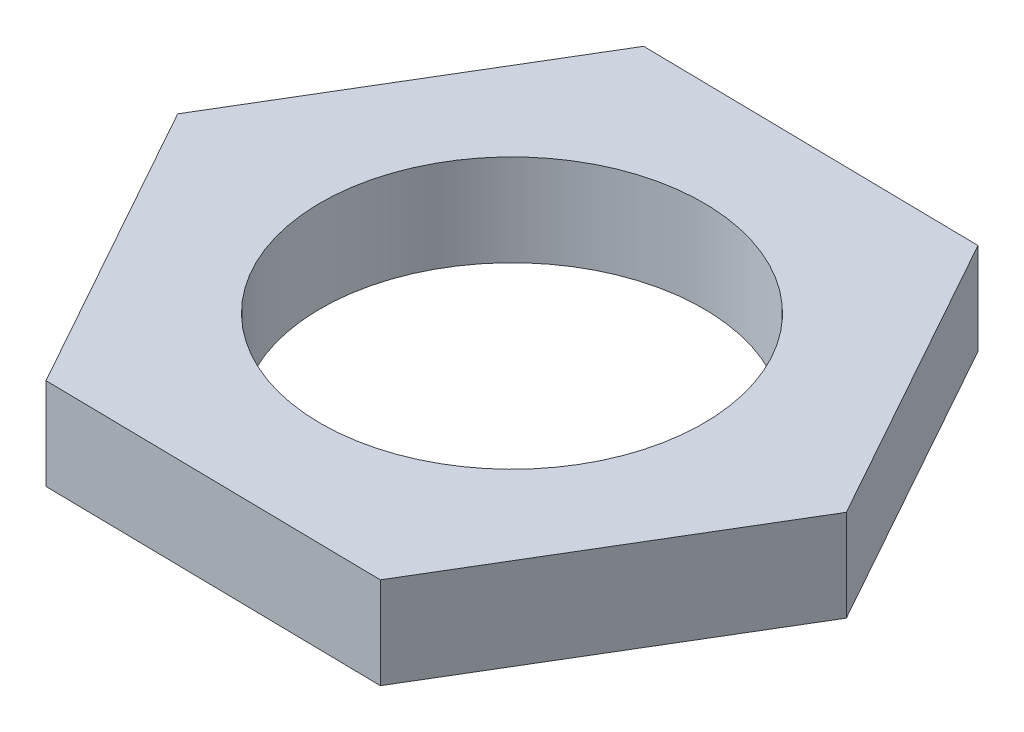
ISO-10303-21;
HEADER;
FILE_DESCRIPTION(('STEP AP214'),'2;1');
FILE_NAME('part.step','',(''),(''),'','','');
FILE_SCHEMA(('AUTOMOTIVE_DESIGN { 1 0 10303 214 1 1 1 1 }'));
ENDSEC;
DATA;
#1=APPLICATION_CONTEXT('core data for automotive mechanical design processes');
#2=APPLICATION_PROTOCOL_DEFINITION('international standard','automotive_design',2000,#1);
#3=PRODUCT_CONTEXT('',#1,'mechanical');
#4=PRODUCT('Part','Part','',(#3));
#5=PRODUCT_RELATED_PRODUCT_CATEGORY('part','',(#4));
#6=PRODUCT_DEFINITION_FORMATION('','',#4);
#7=PRODUCT_DEFINITION_CONTEXT('part definition',#1,'design');
#8=PRODUCT_DEFINITION('design','',#6,#7);
#9=PRODUCT_DEFINITION_SHAPE('','',#8);
#10=(LENGTH_UNIT() NAMED_UNIT(*) SI_UNIT(.MILLI.,.METRE.));
#11=(NAMED_UNIT(*) PLANE_ANGLE_UNIT() SI_UNIT($,.RADIAN.));
#12=(NAMED_UNIT(*) SI_UNIT($,.STERADIAN.) SOLID_ANGLE_UNIT());
#13=UNCERTAINTY_MEASURE_WITH_UNIT(LENGTH_MEASURE(1.E-05),#10,'distance_accuracy_value','');
#14=(GEOMETRIC_REPRESENTATION_CONTEXT(3) GLOBAL_UNCERTAINTY_ASSIGNED_CONTEXT((#13)) GLOBAL_UNIT_ASSIGNED_CONTEXT((#10,
#11,#12)) REPRESENTATION_CONTEXT('',''));
#15=CARTESIAN_POINT('',(0.,0.,0.));
#16=DIRECTION('',(0.,0.,1.));
#17=DIRECTION('',(1.,0.,0.));
#18=AXIS2_PLACEMENT_3D('',#15,#16,#17);
#19=CARTESIAN_POINT('',(0.,2.3,0.));
#20=DIRECTION('',(0.,1.,0.));
#21=DIRECTION('',(0.,0.,1.));
#22=AXIS2_PLACEMENT_3D('',#19,#20,#21);
#23=PLANE('',#22);
#24=DIRECTION('',(0.48623772395822,0.,0.873826570779311));
#25=VECTOR('',#24,1.);
#26=CARTESIAN_POINT('',(-8.52314715754262,2.3,-0.134845084821063));
#27=LINE('',#26,#25);
#28=CARTESIAN_POINT('',(-8.52314715754262,2.3,-0.134845084821063));
#29=VERTEX_POINT('',#28);
#30=CARTESIAN_POINT('',(-4.37835284780182,2.3,7.31383941621451));
#31=VERTEX_POINT('',#30);
#32=EDGE_CURVE('E128',#29,#31,#27,.T.);
#33=ORIENTED_EDGE('',*,*,#32,.T.);
#34=DIRECTION('',(0.999874870775834,0.,0.0158190641635116));
#35=VECTOR('',#34,1.);
#36=CARTESIAN_POINT('',(-4.37835284780182,2.3,7.31383941621451));
#37=LINE('',#36,#35);
#38=CARTESIAN_POINT('',(4.1447943097408,2.3,7.44868450103557));
#39=VERTEX_POINT('',#38);
#40=EDGE_CURVE('E86',#31,#39,#37,.T.);
#41=ORIENTED_EDGE('',*,*,#40,.T.);
#42=DIRECTION('',(0.513637146817613,0.,-0.8580075066158));
#43=VECTOR('',#42,1.);
#44=CARTESIAN_POINT('',(4.1447943097408,2.3,7.44868450103557));
#45=LINE('',#44,#43);
#46=CARTESIAN_POINT('',(8.52314715754262,2.3,0.134845084821061));
#47=VERTEX_POINT('',#46);
#48=EDGE_CURVE('E99',#39,#47,#45,.T.);
#49=ORIENTED_EDGE('',*,*,#48,.T.);
#50=DIRECTION('',(-0.48623772395822,0.,-0.873826570779311));
#51=VECTOR('',#50,1.);
#52=CARTESIAN_POINT('',(8.52314715754262,2.3,0.134845084821061));
#53=LINE('',#52,#51);
#54=CARTESIAN_POINT('',(4.37835284780181,2.3,-7.31383941621451));
#55=VERTEX_POINT('',#54);
#56=EDGE_CURVE('E93',#47,#55,#53,.T.);
#57=ORIENTED_EDGE('',*,*,#56,.T.);
#58=DIRECTION('',(-0.999874870775834,0.,-0.0158190641635113));
#59=VECTOR('',#58,1.);
#60=CARTESIAN_POINT('',(4.37835284780181,2.3,-7.31383941621451));
#61=LINE('',#60,#59);
#62=CARTESIAN_POINT('',(-4.1447943097408,2.3,-7.44868450103557));
#63=VERTEX_POINT('',#62);
#64=EDGE_CURVE('E97',#55,#63,#61,.T.);
#65=ORIENTED_EDGE('',*,*,#64,.T.);
#66=DIRECTION('',(-0.513637146817614,0.,0.858007506615799));
#67=VECTOR('',#66,1.);
#68=CARTESIAN_POINT('',(-4.1447943097408,2.3,-7.44868450103557));
#69=LINE('',#68,#67);
#70=EDGE_CURVE('E49',#63,#29,#69,.T.);
#71=ORIENTED_EDGE('',*,*,#70,.T.);
#72=EDGE_LOOP('',(#33,#41,#49,#57,#65,#71));
#73=FACE_BOUND('',#72,.T.);
#74=CARTESIAN_POINT('',(0.,2.3,0.));
#75=DIRECTION('',(0.,1.,0.));
#76=DIRECTION('',(0.,0.,1.));
#77=AXIS2_PLACEMENT_3D('',#74,#75,#76);
#78=CIRCLE('',#77,4.8);
#79=CARTESIAN_POINT('',(0.,2.3,4.8));
#80=VERTEX_POINT('',#79);
#81=EDGE_CURVE('E121',#80,#80,#78,.T.);
#82=ORIENTED_EDGE('',*,*,#81,.F.);
#83=EDGE_LOOP('',(#82));
#84=FACE_BOUND('',#83,.T.);
#85=ADVANCED_FACE('F32',(#73,#84),#23,.T.);
#86=CARTESIAN_POINT('',(0.,0.,0.));
#87=DIRECTION('',(0.,1.,0.));
#88=DIRECTION('',(0.,0.,1.));
#89=AXIS2_PLACEMENT_3D('',#86,#87,#88);
#90=PLANE('',#89);
#91=DIRECTION('',(0.48623772395822,0.,0.873826570779311));
#92=VECTOR('',#91,1.);
#93=CARTESIAN_POINT('',(-8.52314715754262,0.,-0.134845084821063));
#94=LINE('',#93,#92);
#95=CARTESIAN_POINT('',(-8.52314715754262,0.,-0.134845084821063));
#96=VERTEX_POINT('',#95);
#97=CARTESIAN_POINT('',(-4.37835284780182,0.,7.31383941621451));
#98=VERTEX_POINT('',#97);
#99=EDGE_CURVE('E117',#96,#98,#94,.T.);
#100=ORIENTED_EDGE('',*,*,#99,.F.);
#101=DIRECTION('',(-0.513637146817614,0.,0.858007506615799));
#102=VECTOR('',#101,1.);
#103=CARTESIAN_POINT('',(-4.1447943097408,0.,-7.44868450103557));
#104=LINE('',#103,#102);
#105=CARTESIAN_POINT('',(-4.1447943097408,0.,-7.44868450103557));
#106=VERTEX_POINT('',#105);
#107=EDGE_CURVE('E78',#106,#96,#104,.T.);
#108=ORIENTED_EDGE('',*,*,#107,.F.);
#109=DIRECTION('',(-0.999874870775834,0.,-0.0158190641635113));
#110=VECTOR('',#109,1.);
#111=CARTESIAN_POINT('',(4.37835284780181,0.,-7.31383941621451));
#112=LINE('',#111,#110);
#113=CARTESIAN_POINT('',(4.37835284780181,0.,-7.31383941621451));
#114=VERTEX_POINT('',#113);
#115=EDGE_CURVE('E72',#114,#106,#112,.T.);
#116=ORIENTED_EDGE('',*,*,#115,.F.);
#117=DIRECTION('',(-0.48623772395822,0.,-0.873826570779311));
#118=VECTOR('',#117,1.);
#119=CARTESIAN_POINT('',(8.52314715754262,0.,0.134845084821061));
#120=LINE('',#119,#118);
#121=CARTESIAN_POINT('',(8.52314715754262,0.,0.134845084821061));
#122=VERTEX_POINT('',#121);
#123=EDGE_CURVE('E107',#122,#114,#120,.T.);
#124=ORIENTED_EDGE('',*,*,#123,.F.);
#125=DIRECTION('',(0.513637146817613,0.,-0.8580075066158));
#126=VECTOR('',#125,1.);
#127=CARTESIAN_POINT('',(4.1447943097408,0.,7.44868450103557));
#128=LINE('',#127,#126);
#129=CARTESIAN_POINT('',(4.1447943097408,0.,7.44868450103557));
#130=VERTEX_POINT('',#129);
#131=EDGE_CURVE('E123',#130,#122,#128,.T.);
#132=ORIENTED_EDGE('',*,*,#131,.F.);
#133=DIRECTION('',(0.999874870775834,0.,0.0158190641635116));
#134=VECTOR('',#133,1.);
#135=CARTESIAN_POINT('',(-4.37835284780182,0.,7.31383941621451));
#136=LINE('',#135,#134);
#137=EDGE_CURVE('E120',#98,#130,#136,.T.);
#138=ORIENTED_EDGE('',*,*,#137,.F.);
#139=EDGE_LOOP('',(#100,#108,#116,#124,#132,#138));
#140=FACE_BOUND('',#139,.T.);
#141=CARTESIAN_POINT('',(0.,0.,0.));
#142=DIRECTION('',(0.,1.,0.));
#143=DIRECTION('',(0.,0.,1.));
#144=AXIS2_PLACEMENT_3D('',#141,#142,#143);
#145=CIRCLE('',#144,4.8);
#146=CARTESIAN_POINT('',(0.,0.,4.8));
#147=VERTEX_POINT('',#146);
#148=EDGE_CURVE('E221',#147,#147,#145,.T.);
#149=ORIENTED_EDGE('',*,*,#148,.T.);
#150=EDGE_LOOP('',(#149));
#151=FACE_BOUND('',#150,.T.);
#152=ADVANCED_FACE('F137',(#140,#151),#90,.F.);
#153=CARTESIAN_POINT('',(-8.52314715754262,2.3,-0.134845084821063));
#154=DIRECTION('',(0.873826570779311,0.,-0.48623772395822));
#155=DIRECTION('',(-0.48623772395822,0.,-0.873826570779311));
#156=AXIS2_PLACEMENT_3D('',#153,#154,#155);
#157=PLANE('',#156);
#158=ORIENTED_EDGE('',*,*,#99,.T.);
#159=DIRECTION('',(0.,-1.,0.));
#160=VECTOR('',#159,1.);
#161=CARTESIAN_POINT('',(-4.37835284780182,2.3,7.31383941621451));
#162=LINE('',#161,#160);
#163=EDGE_CURVE('E11',#31,#98,#162,.T.);
#164=ORIENTED_EDGE('',*,*,#163,.F.);
#165=ORIENTED_EDGE('',*,*,#32,.F.);
#166=DIRECTION('',(0.,-1.,0.));
#167=VECTOR('',#166,1.);
#168=CARTESIAN_POINT('',(-8.52314715754262,2.3,-0.134845084821063));
#169=LINE('',#168,#167);
#170=EDGE_CURVE('E113',#29,#96,#169,.T.);
#171=ORIENTED_EDGE('',*,*,#170,.T.);
#172=EDGE_LOOP('',(#158,#164,#165,#171));
#173=FACE_BOUND('',#172,.T.);
#174=ADVANCED_FACE('F34',(#173),#157,.F.);
#175=CARTESIAN_POINT('',(-4.37835284780182,2.3,7.31383941621451));
#176=DIRECTION('',(0.0158190641635116,0.,-0.999874870775834));
#177=DIRECTION('',(-0.999874870775834,0.,-0.0158190641635116));
#178=AXIS2_PLACEMENT_3D('',#175,#176,#177);
#179=PLANE('',#178);
#180=ORIENTED_EDGE('',*,*,#137,.T.);
#181=DIRECTION('',(0.,-1.,0.));
#182=VECTOR('',#181,1.);
#183=CARTESIAN_POINT('',(4.1447943097408,2.3,7.44868450103557));
#184=LINE('',#183,#182);
#185=EDGE_CURVE('E41',#39,#130,#184,.T.);
#186=ORIENTED_EDGE('',*,*,#185,.F.);
#187=ORIENTED_EDGE('',*,*,#40,.F.);
#188=ORIENTED_EDGE('',*,*,#163,.T.);
#189=EDGE_LOOP('',(#180,#186,#187,#188));
#190=FACE_BOUND('',#189,.T.);
#191=ADVANCED_FACE('F162',(#190),#179,.F.);
#192=CARTESIAN_POINT('',(4.1447943097408,2.3,7.44868450103557));
#193=DIRECTION('',(-0.8580075066158,0.,-0.513637146817613));
#194=DIRECTION('',(-0.513637146817613,0.,0.8580075066158));
#195=AXIS2_PLACEMENT_3D('',#192,#193,#194);
#196=PLANE('',#195);
#197=ORIENTED_EDGE('',*,*,#131,.T.);
#198=DIRECTION('',(0.,-1.,0.));
#199=VECTOR('',#198,1.);
#200=CARTESIAN_POINT('',(8.52314715754262,2.3,0.134845084821061));
#201=LINE('',#200,#199);
#202=EDGE_CURVE('E108',#47,#122,#201,.T.);
#203=ORIENTED_EDGE('',*,*,#202,.F.);
#204=ORIENTED_EDGE('',*,*,#48,.F.);
#205=ORIENTED_EDGE('',*,*,#185,.T.);
#206=EDGE_LOOP('',(#197,#203,#204,#205));
#207=FACE_BOUND('',#206,.T.);
#208=ADVANCED_FACE('F134',(#207),#196,.F.);
#209=CARTESIAN_POINT('',(8.52314715754262,2.3,0.134845084821061));
#210=DIRECTION('',(-0.873826570779311,0.,0.48623772395822));
#211=DIRECTION('',(0.48623772395822,0.,0.873826570779311));
#212=AXIS2_PLACEMENT_3D('',#209,#210,#211);
#213=PLANE('',#212);
#214=ORIENTED_EDGE('',*,*,#123,.T.);
#215=DIRECTION('',(0.,-1.,0.));
#216=VECTOR('',#215,1.);
#217=CARTESIAN_POINT('',(4.37835284780181,2.3,-7.31383941621451));
#218=LINE('',#217,#216);
#219=EDGE_CURVE('E104',#55,#114,#218,.T.);
#220=ORIENTED_EDGE('',*,*,#219,.F.);
#221=ORIENTED_EDGE('',*,*,#56,.F.);
#222=ORIENTED_EDGE('',*,*,#202,.T.);
#223=EDGE_LOOP('',(#214,#220,#221,#222));
#224=FACE_BOUND('',#223,.T.);
#225=ADVANCED_FACE('F105',(#224),#213,.F.);
#226=CARTESIAN_POINT('',(4.37835284780181,2.3,-7.31383941621451));
#227=DIRECTION('',(-0.0158190641635113,0.,0.999874870775834));
#228=DIRECTION('',(0.999874870775834,0.,0.0158190641635113));
#229=AXIS2_PLACEMENT_3D('',#226,#227,#228);
#230=PLANE('',#229);
#231=ORIENTED_EDGE('',*,*,#115,.T.);
#232=DIRECTION('',(0.,-1.,0.));
#233=VECTOR('',#232,1.);
#234=CARTESIAN_POINT('',(-4.1447943097408,2.3,-7.44868450103557));
#235=LINE('',#234,#233);
#236=EDGE_CURVE('E109',#63,#106,#235,.T.);
#237=ORIENTED_EDGE('',*,*,#236,.F.);
#238=ORIENTED_EDGE('',*,*,#64,.F.);
#239=ORIENTED_EDGE('',*,*,#219,.T.);
#240=EDGE_LOOP('',(#231,#237,#238,#239));
#241=FACE_BOUND('',#240,.T.);
#242=ADVANCED_FACE('F111',(#241),#230,.F.);
#243=CARTESIAN_POINT('',(-4.1447943097408,2.3,-7.44868450103557));
#244=DIRECTION('',(0.858007506615799,0.,0.513637146817614));
#245=DIRECTION('',(0.513637146817614,0.,-0.858007506615799));
#246=AXIS2_PLACEMENT_3D('',#243,#244,#245);
#247=PLANE('',#246);
#248=ORIENTED_EDGE('',*,*,#107,.T.);
#249=ORIENTED_EDGE('',*,*,#170,.F.);
#250=ORIENTED_EDGE('',*,*,#70,.F.);
#251=ORIENTED_EDGE('',*,*,#236,.T.);
#252=EDGE_LOOP('',(#248,#249,#250,#251));
#253=FACE_BOUND('',#252,.T.);
#254=ADVANCED_FACE('F142',(#253),#247,.F.);
#255=CARTESIAN_POINT('',(0.,2.3,0.));
#256=DIRECTION('',(0.,-1.,0.));
#257=DIRECTION('',(0.,0.,-1.));
#258=AXIS2_PLACEMENT_3D('',#255,#256,#257);
#259=CYLINDRICAL_SURFACE('',#258,4.8);
#260=ORIENTED_EDGE('',*,*,#81,.T.);
#261=EDGE_LOOP('',(#260));
#262=FACE_BOUND('',#261,.T.);
#263=ORIENTED_EDGE('',*,*,#148,.F.);
#264=EDGE_LOOP('',(#263));
#265=FACE_BOUND('',#264,.T.);
#266=ADVANCED_FACE('F144',(#262,#265),#259,.F.);
#267=CLOSED_SHELL('',(#85,#152,#174,#191,#208,#225,#242,#254,#266));
#268=MANIFOLD_SOLID_BREP('B2',#267);
#269=ADVANCED_BREP_SHAPE_REPRESENTATION('',(#18,#268),#14);
#270=SHAPE_DEFINITION_REPRESENTATION(#9,#269);
ENDSEC;
END-ISO-10303-21;
